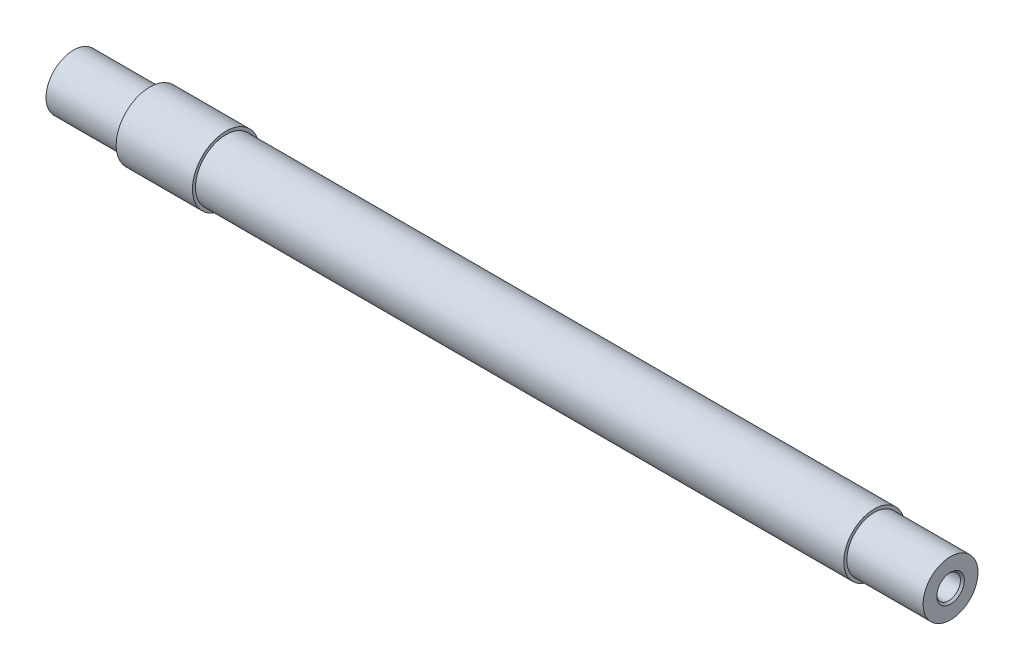
ISO-10303-21;
HEADER;
FILE_DESCRIPTION(('STEP AP214'),'2;1');
FILE_NAME('part.step','',(''),(''),'','','');
FILE_SCHEMA(('AUTOMOTIVE_DESIGN { 1 0 10303 214 1 1 1 1 }'));
ENDSEC;
DATA;
#1=APPLICATION_CONTEXT('core data for automotive mechanical design processes');
#2=APPLICATION_PROTOCOL_DEFINITION('international standard','automotive_design',2000,#1);
#3=PRODUCT_CONTEXT('',#1,'mechanical');
#4=PRODUCT('Part','Part','',(#3));
#5=PRODUCT_RELATED_PRODUCT_CATEGORY('part','',(#4));
#6=PRODUCT_DEFINITION_FORMATION('','',#4);
#7=PRODUCT_DEFINITION_CONTEXT('part definition',#1,'design');
#8=PRODUCT_DEFINITION('design','',#6,#7);
#9=PRODUCT_DEFINITION_SHAPE('','',#8);
#10=(LENGTH_UNIT() NAMED_UNIT(*) SI_UNIT(.MILLI.,.METRE.));
#11=(NAMED_UNIT(*) PLANE_ANGLE_UNIT() SI_UNIT($,.RADIAN.));
#12=(NAMED_UNIT(*) SI_UNIT($,.STERADIAN.) SOLID_ANGLE_UNIT());
#13=UNCERTAINTY_MEASURE_WITH_UNIT(LENGTH_MEASURE(1.E-05),#10,'distance_accuracy_value','');
#14=(GEOMETRIC_REPRESENTATION_CONTEXT(3) GLOBAL_UNCERTAINTY_ASSIGNED_CONTEXT((#13)) GLOBAL_UNIT_ASSIGNED_CONTEXT((#10,
#11,#12)) REPRESENTATION_CONTEXT('',''));
#15=CARTESIAN_POINT('',(0.,0.,0.));
#16=DIRECTION('',(0.,0.,1.));
#17=DIRECTION('',(1.,0.,0.));
#18=AXIS2_PLACEMENT_3D('',#15,#16,#17);
#19=CARTESIAN_POINT('',(0.,0.,0.));
#20=DIRECTION('',(-1.,0.,0.));
#21=DIRECTION('',(0.,-1.,0.));
#22=AXIS2_PLACEMENT_3D('',#19,#20,#21);
#23=PLANE('',#22);
#24=CARTESIAN_POINT('',(0.,0.,0.));
#25=DIRECTION('',(-1.,0.,0.));
#26=DIRECTION('',(0.,0.,1.));
#27=AXIS2_PLACEMENT_3D('',#24,#25,#26);
#28=CIRCLE('',#27,9.025);
#29=CARTESIAN_POINT('',(0.,0.,9.025));
#30=VERTEX_POINT('',#29);
#31=EDGE_CURVE('E70',#30,#30,#28,.T.);
#32=ORIENTED_EDGE('',*,*,#31,.F.);
#33=EDGE_LOOP('',(#32));
#34=FACE_BOUND('',#33,.T.);
#35=CARTESIAN_POINT('',(0.,0.,0.));
#36=DIRECTION('',(1.,0.,0.));
#37=DIRECTION('',(0.,1.,0.));
#38=AXIS2_PLACEMENT_3D('',#35,#36,#37);
#39=CIRCLE('',#38,17.9999999999999);
#40=CARTESIAN_POINT('',(0.,17.9999999999999,0.));
#41=VERTEX_POINT('',#40);
#42=EDGE_CURVE('E11',#41,#41,#39,.T.);
#43=ORIENTED_EDGE('',*,*,#42,.F.);
#44=EDGE_LOOP('',(#43));
#45=FACE_BOUND('',#44,.T.);
#46=ADVANCED_FACE('F45',(#34,#45),#23,.T.);
#47=CARTESIAN_POINT('',(575.,0.,0.));
#48=DIRECTION('',(1.,0.,0.));
#49=DIRECTION('',(0.,1.,0.));
#50=AXIS2_PLACEMENT_3D('',#47,#48,#49);
#51=CYLINDRICAL_SURFACE('',#50,17.9999999999999);
#52=ORIENTED_EDGE('',*,*,#42,.T.);
#53=EDGE_LOOP('',(#52));
#54=FACE_BOUND('',#53,.T.);
#55=CARTESIAN_POINT('',(50.,0.,0.));
#56=DIRECTION('',(1.,0.,0.));
#57=DIRECTION('',(0.,1.,0.));
#58=AXIS2_PLACEMENT_3D('',#55,#56,#57);
#59=CIRCLE('',#58,17.9999999999999);
#60=CARTESIAN_POINT('',(50.,17.9999999999999,0.));
#61=VERTEX_POINT('',#60);
#62=EDGE_CURVE('E53',#61,#61,#59,.T.);
#63=ORIENTED_EDGE('',*,*,#62,.F.);
#64=EDGE_LOOP('',(#63));
#65=FACE_BOUND('',#64,.T.);
#66=ADVANCED_FACE('F120',(#54,#65),#51,.T.);
#67=CARTESIAN_POINT('',(50.,17.9999999999999,0.));
#68=DIRECTION('',(-1.,0.,0.));
#69=DIRECTION('',(0.,-1.,0.));
#70=AXIS2_PLACEMENT_3D('',#67,#68,#69);
#71=PLANE('',#70);
#72=ORIENTED_EDGE('',*,*,#62,.T.);
#73=EDGE_LOOP('',(#72));
#74=FACE_BOUND('',#73,.T.);
#75=CARTESIAN_POINT('',(50.,0.,0.));
#76=DIRECTION('',(1.,0.,0.));
#77=DIRECTION('',(0.,1.,0.));
#78=AXIS2_PLACEMENT_3D('',#75,#76,#77);
#79=CIRCLE('',#78,21.9999999999999);
#80=CARTESIAN_POINT('',(50.,21.9999999999999,0.));
#81=VERTEX_POINT('',#80);
#82=EDGE_CURVE('E110',#81,#81,#79,.T.);
#83=ORIENTED_EDGE('',*,*,#82,.F.);
#84=EDGE_LOOP('',(#83));
#85=FACE_BOUND('',#84,.T.);
#86=ADVANCED_FACE('F117',(#74,#85),#71,.T.);
#87=CARTESIAN_POINT('',(575.,0.,0.));
#88=DIRECTION('',(1.,0.,0.));
#89=DIRECTION('',(0.,1.,0.));
#90=AXIS2_PLACEMENT_3D('',#87,#88,#89);
#91=CYLINDRICAL_SURFACE('',#90,21.9999999999999);
#92=ORIENTED_EDGE('',*,*,#82,.T.);
#93=EDGE_LOOP('',(#92));
#94=FACE_BOUND('',#93,.T.);
#95=CARTESIAN_POINT('',(100.,0.,0.));
#96=DIRECTION('',(1.,0.,0.));
#97=DIRECTION('',(0.,1.,0.));
#98=AXIS2_PLACEMENT_3D('',#95,#96,#97);
#99=CIRCLE('',#98,21.9999999999999);
#100=CARTESIAN_POINT('',(100.,21.9999999999999,0.));
#101=VERTEX_POINT('',#100);
#102=EDGE_CURVE('E106',#101,#101,#99,.T.);
#103=ORIENTED_EDGE('',*,*,#102,.F.);
#104=EDGE_LOOP('',(#103));
#105=FACE_BOUND('',#104,.T.);
#106=ADVANCED_FACE('F127',(#94,#105),#91,.T.);
#107=CARTESIAN_POINT('',(100.,21.9999999999999,0.));
#108=DIRECTION('',(1.,0.,0.));
#109=DIRECTION('',(0.,1.,0.));
#110=AXIS2_PLACEMENT_3D('',#107,#108,#109);
#111=PLANE('',#110);
#112=ORIENTED_EDGE('',*,*,#102,.T.);
#113=EDGE_LOOP('',(#112));
#114=FACE_BOUND('',#113,.T.);
#115=CARTESIAN_POINT('',(100.,0.,0.));
#116=DIRECTION('',(1.,0.,0.));
#117=DIRECTION('',(0.,1.,0.));
#118=AXIS2_PLACEMENT_3D('',#115,#116,#117);
#119=CIRCLE('',#118,19.9999999999999);
#120=CARTESIAN_POINT('',(100.,19.9999999999999,0.));
#121=VERTEX_POINT('',#120);
#122=EDGE_CURVE('E102',#121,#121,#119,.T.);
#123=ORIENTED_EDGE('',*,*,#122,.F.);
#124=EDGE_LOOP('',(#123));
#125=FACE_BOUND('',#124,.T.);
#126=ADVANCED_FACE('F133',(#114,#125),#111,.T.);
#127=CARTESIAN_POINT('',(575.,0.,0.));
#128=DIRECTION('',(1.,0.,0.));
#129=DIRECTION('',(0.,1.,0.));
#130=AXIS2_PLACEMENT_3D('',#127,#128,#129);
#131=CYLINDRICAL_SURFACE('',#130,19.9999999999999);
#132=ORIENTED_EDGE('',*,*,#122,.T.);
#133=EDGE_LOOP('',(#132));
#134=FACE_BOUND('',#133,.T.);
#135=CARTESIAN_POINT('',(525.,0.,0.));
#136=DIRECTION('',(1.,0.,0.));
#137=DIRECTION('',(0.,1.,0.));
#138=AXIS2_PLACEMENT_3D('',#135,#136,#137);
#139=CIRCLE('',#138,19.9999999999999);
#140=CARTESIAN_POINT('',(525.,19.9999999999999,0.));
#141=VERTEX_POINT('',#140);
#142=EDGE_CURVE('E98',#141,#141,#139,.T.);
#143=ORIENTED_EDGE('',*,*,#142,.F.);
#144=EDGE_LOOP('',(#143));
#145=FACE_BOUND('',#144,.T.);
#146=ADVANCED_FACE('F137',(#134,#145),#131,.T.);
#147=CARTESIAN_POINT('',(525.,19.9999999999999,0.));
#148=DIRECTION('',(1.,0.,0.));
#149=DIRECTION('',(0.,1.,0.));
#150=AXIS2_PLACEMENT_3D('',#147,#148,#149);
#151=PLANE('',#150);
#152=ORIENTED_EDGE('',*,*,#142,.T.);
#153=EDGE_LOOP('',(#152));
#154=FACE_BOUND('',#153,.T.);
#155=CARTESIAN_POINT('',(525.,0.,0.));
#156=DIRECTION('',(1.,0.,0.));
#157=DIRECTION('',(0.,1.,0.));
#158=AXIS2_PLACEMENT_3D('',#155,#156,#157);
#159=CIRCLE('',#158,17.9999999999999);
#160=CARTESIAN_POINT('',(525.,17.9999999999999,0.));
#161=VERTEX_POINT('',#160);
#162=EDGE_CURVE('E94',#161,#161,#159,.T.);
#163=ORIENTED_EDGE('',*,*,#162,.F.);
#164=EDGE_LOOP('',(#163));
#165=FACE_BOUND('',#164,.T.);
#166=ADVANCED_FACE('F141',(#154,#165),#151,.T.);
#167=CARTESIAN_POINT('',(575.,0.,0.));
#168=DIRECTION('',(1.,0.,0.));
#169=DIRECTION('',(0.,1.,0.));
#170=AXIS2_PLACEMENT_3D('',#167,#168,#169);
#171=CYLINDRICAL_SURFACE('',#170,17.9999999999999);
#172=ORIENTED_EDGE('',*,*,#162,.T.);
#173=EDGE_LOOP('',(#172));
#174=FACE_BOUND('',#173,.T.);
#175=CARTESIAN_POINT('',(575.,0.,0.));
#176=DIRECTION('',(1.,0.,0.));
#177=DIRECTION('',(0.,1.,0.));
#178=AXIS2_PLACEMENT_3D('',#175,#176,#177);
#179=CIRCLE('',#178,17.9999999999999);
#180=CARTESIAN_POINT('',(575.,17.9999999999999,0.));
#181=VERTEX_POINT('',#180);
#182=EDGE_CURVE('E90',#181,#181,#179,.T.);
#183=ORIENTED_EDGE('',*,*,#182,.F.);
#184=EDGE_LOOP('',(#183));
#185=FACE_BOUND('',#184,.T.);
#186=ADVANCED_FACE('F145',(#174,#185),#171,.T.);
#187=CARTESIAN_POINT('',(575.,17.9999999999999,0.));
#188=DIRECTION('',(1.,0.,0.));
#189=DIRECTION('',(0.,1.,0.));
#190=AXIS2_PLACEMENT_3D('',#187,#188,#189);
#191=PLANE('',#190);
#192=CARTESIAN_POINT('',(575.,0.,0.));
#193=DIRECTION('',(1.,0.,0.));
#194=DIRECTION('',(0.,0.,-1.));
#195=AXIS2_PLACEMENT_3D('',#192,#193,#194);
#196=CIRCLE('',#195,9.025);
#197=CARTESIAN_POINT('',(575.,0.,-9.025));
#198=VERTEX_POINT('',#197);
#199=EDGE_CURVE('E79',#198,#198,#196,.T.);
#200=ORIENTED_EDGE('',*,*,#199,.F.);
#201=EDGE_LOOP('',(#200));
#202=FACE_BOUND('',#201,.T.);
#203=ORIENTED_EDGE('',*,*,#182,.T.);
#204=EDGE_LOOP('',(#203));
#205=FACE_BOUND('',#204,.T.);
#206=ADVANCED_FACE('F149',(#202,#205),#191,.T.);
#207=CARTESIAN_POINT('',(25.,0.,0.));
#208=DIRECTION('',(-1.,0.,0.));
#209=DIRECTION('',(0.,0.,1.));
#210=AXIS2_PLACEMENT_3D('',#207,#208,#209);
#211=CONICAL_SURFACE('',#210,7.74999999999999,1.02974425867665);
#212=CARTESIAN_POINT('',(29.6566697974636,0.,0.));
#213=VERTEX_POINT('',#212);
#214=VERTEX_LOOP('',#213);
#215=FACE_BOUND('',#214,.T.);
#216=CARTESIAN_POINT('',(25.,0.,0.));
#217=DIRECTION('',(-1.,0.,0.));
#218=DIRECTION('',(0.,0.,1.));
#219=AXIS2_PLACEMENT_3D('',#216,#217,#218);
#220=CIRCLE('',#219,7.74999999999999);
#221=CARTESIAN_POINT('',(25.,0.,7.74999999999999));
#222=VERTEX_POINT('',#221);
#223=EDGE_CURVE('E86',#222,#222,#220,.T.);
#224=ORIENTED_EDGE('',*,*,#223,.T.);
#225=EDGE_LOOP('',(#224));
#226=FACE_BOUND('',#225,.T.);
#227=ADVANCED_FACE('F153',(#215,#226),#211,.F.);
#228=CARTESIAN_POINT('',(0.,0.,0.));
#229=DIRECTION('',(-1.,0.,0.));
#230=DIRECTION('',(0.,0.,1.));
#231=AXIS2_PLACEMENT_3D('',#228,#229,#230);
#232=CYLINDRICAL_SURFACE('',#231,7.74999999999999);
#233=ORIENTED_EDGE('',*,*,#223,.F.);
#234=EDGE_LOOP('',(#233));
#235=FACE_BOUND('',#234,.T.);
#236=CARTESIAN_POINT('',(1.27500000000001,0.,0.));
#237=DIRECTION('',(-1.,0.,0.));
#238=DIRECTION('',(0.,0.,1.));
#239=AXIS2_PLACEMENT_3D('',#236,#237,#238);
#240=CIRCLE('',#239,7.74999999999999);
#241=CARTESIAN_POINT('',(1.27500000000001,0.,7.74999999999999));
#242=VERTEX_POINT('',#241);
#243=EDGE_CURVE('E76',#242,#242,#240,.T.);
#244=ORIENTED_EDGE('',*,*,#243,.T.);
#245=EDGE_LOOP('',(#244));
#246=FACE_BOUND('',#245,.T.);
#247=ADVANCED_FACE('F157',(#235,#246),#232,.F.);
#248=CARTESIAN_POINT('',(0.,0.,0.));
#249=DIRECTION('',(-1.,0.,0.));
#250=DIRECTION('',(0.,0.,1.));
#251=AXIS2_PLACEMENT_3D('',#248,#249,#250);
#252=CONICAL_SURFACE('',#251,9.025,0.785398163397446);
#253=ORIENTED_EDGE('',*,*,#243,.F.);
#254=EDGE_LOOP('',(#253));
#255=FACE_BOUND('',#254,.T.);
#256=ORIENTED_EDGE('',*,*,#31,.T.);
#257=EDGE_LOOP('',(#256));
#258=FACE_BOUND('',#257,.T.);
#259=ADVANCED_FACE('F63',(#255,#258),#252,.F.);
#260=CARTESIAN_POINT('',(550.,0.,0.));
#261=DIRECTION('',(1.,0.,0.));
#262=DIRECTION('',(0.,0.,-1.));
#263=AXIS2_PLACEMENT_3D('',#260,#261,#262);
#264=CONICAL_SURFACE('',#263,7.74999999999999,1.02974425867665);
#265=CARTESIAN_POINT('',(545.343330202536,0.,0.));
#266=VERTEX_POINT('',#265);
#267=VERTEX_LOOP('',#266);
#268=FACE_BOUND('',#267,.T.);
#269=CARTESIAN_POINT('',(550.,0.,0.));
#270=DIRECTION('',(1.,0.,0.));
#271=DIRECTION('',(0.,0.,-1.));
#272=AXIS2_PLACEMENT_3D('',#269,#270,#271);
#273=CIRCLE('',#272,7.74999999999999);
#274=CARTESIAN_POINT('',(550.,0.,-7.74999999999999));
#275=VERTEX_POINT('',#274);
#276=EDGE_CURVE('E67',#275,#275,#273,.T.);
#277=ORIENTED_EDGE('',*,*,#276,.T.);
#278=EDGE_LOOP('',(#277));
#279=FACE_BOUND('',#278,.T.);
#280=ADVANCED_FACE('F59',(#268,#279),#264,.F.);
#281=CARTESIAN_POINT('',(575.,0.,0.));
#282=DIRECTION('',(1.,0.,0.));
#283=DIRECTION('',(0.,0.,-1.));
#284=AXIS2_PLACEMENT_3D('',#281,#282,#283);
#285=CYLINDRICAL_SURFACE('',#284,7.74999999999999);
#286=ORIENTED_EDGE('',*,*,#276,.F.);
#287=EDGE_LOOP('',(#286));
#288=FACE_BOUND('',#287,.T.);
#289=CARTESIAN_POINT('',(573.725,0.,0.));
#290=DIRECTION('',(1.,0.,0.));
#291=DIRECTION('',(0.,0.,-1.));
#292=AXIS2_PLACEMENT_3D('',#289,#290,#291);
#293=CIRCLE('',#292,7.74999999999999);
#294=CARTESIAN_POINT('',(573.725,0.,-7.74999999999999));
#295=VERTEX_POINT('',#294);
#296=EDGE_CURVE('E71',#295,#295,#293,.T.);
#297=ORIENTED_EDGE('',*,*,#296,.T.);
#298=EDGE_LOOP('',(#297));
#299=FACE_BOUND('',#298,.T.);
#300=ADVANCED_FACE('F62',(#288,#299),#285,.F.);
#301=CARTESIAN_POINT('',(575.,0.,0.));
#302=DIRECTION('',(1.,0.,0.));
#303=DIRECTION('',(0.,0.,-1.));
#304=AXIS2_PLACEMENT_3D('',#301,#302,#303);
#305=CONICAL_SURFACE('',#304,9.025,0.785398163397441);
#306=ORIENTED_EDGE('',*,*,#296,.F.);
#307=EDGE_LOOP('',(#306));
#308=FACE_BOUND('',#307,.T.);
#309=ORIENTED_EDGE('',*,*,#199,.T.);
#310=EDGE_LOOP('',(#309));
#311=FACE_BOUND('',#310,.T.);
#312=ADVANCED_FACE('F166',(#308,#311),#305,.F.);
#313=CLOSED_SHELL('',(#46,#66,#86,#106,#126,#146,#166,#186,#206,#227,#247,#259,#280,#300,#312));
#314=MANIFOLD_SOLID_BREP('B2',#313);
#315=ADVANCED_BREP_SHAPE_REPRESENTATION('',(#18,#314),#14);
#316=SHAPE_DEFINITION_REPRESENTATION(#9,#315);
ENDSEC;
END-ISO-10303-21;
